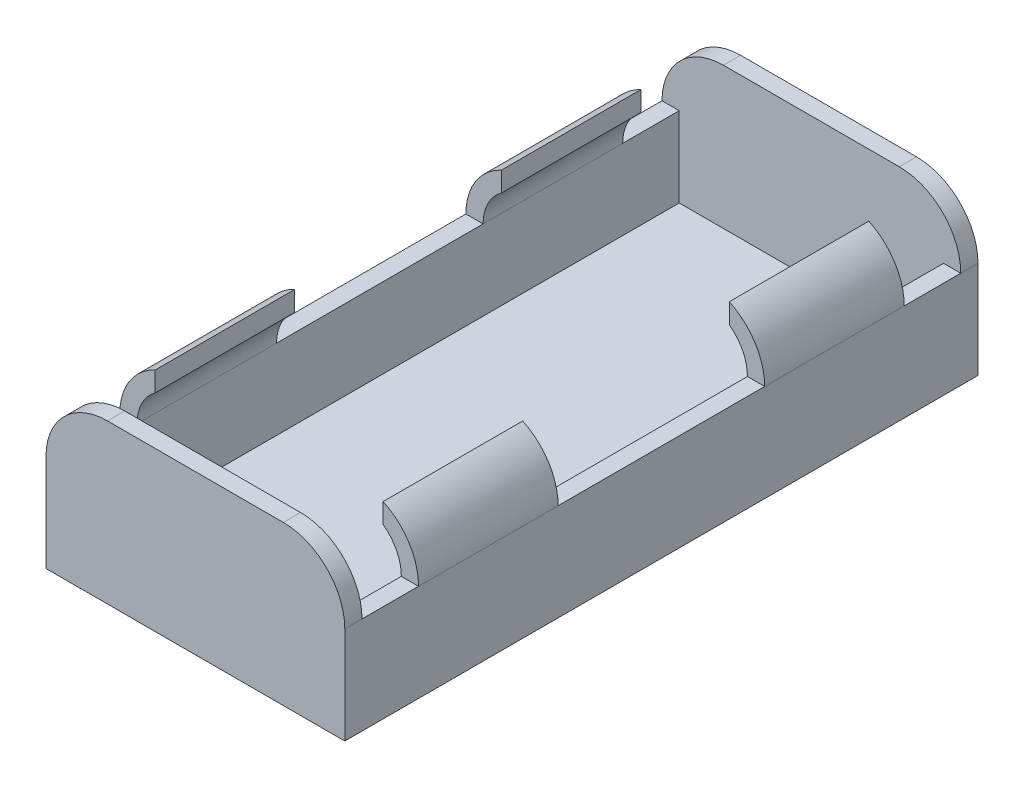
ISO-10303-21;
HEADER;
FILE_DESCRIPTION(('STEP AP214'),'2;1');
FILE_NAME('part.step','',(''),(''),'','','');
FILE_SCHEMA(('AUTOMOTIVE_DESIGN { 1 0 10303 214 1 1 1 1 }'));
ENDSEC;
DATA;
#1=APPLICATION_CONTEXT('core data for automotive mechanical design processes');
#2=APPLICATION_PROTOCOL_DEFINITION('international standard','automotive_design',2000,#1);
#3=PRODUCT_CONTEXT('',#1,'mechanical');
#4=PRODUCT('Part','Part','',(#3));
#5=PRODUCT_RELATED_PRODUCT_CATEGORY('part','',(#4));
#6=PRODUCT_DEFINITION_FORMATION('','',#4);
#7=PRODUCT_DEFINITION_CONTEXT('part definition',#1,'design');
#8=PRODUCT_DEFINITION('design','',#6,#7);
#9=PRODUCT_DEFINITION_SHAPE('','',#8);
#10=(LENGTH_UNIT() NAMED_UNIT(*) SI_UNIT(.MILLI.,.METRE.));
#11=(NAMED_UNIT(*) PLANE_ANGLE_UNIT() SI_UNIT($,.RADIAN.));
#12=(NAMED_UNIT(*) SI_UNIT($,.STERADIAN.) SOLID_ANGLE_UNIT());
#13=UNCERTAINTY_MEASURE_WITH_UNIT(LENGTH_MEASURE(1.E-05),#10,'distance_accuracy_value','');
#14=(GEOMETRIC_REPRESENTATION_CONTEXT(3) GLOBAL_UNCERTAINTY_ASSIGNED_CONTEXT((#13)) GLOBAL_UNIT_ASSIGNED_CONTEXT((#10,
#11,#12)) REPRESENTATION_CONTEXT('',''));
#15=CARTESIAN_POINT('',(0.,0.,0.));
#16=DIRECTION('',(0.,0.,1.));
#17=DIRECTION('',(1.,0.,0.));
#18=AXIS2_PLACEMENT_3D('',#15,#16,#17);
#19=CARTESIAN_POINT('',(-7.15,1.45,51.5));
#20=DIRECTION('',(0.,0.,-1.));
#21=DIRECTION('',(-1.,0.,0.));
#22=AXIS2_PLACEMENT_3D('',#19,#20,#21);
#23=CYLINDRICAL_SURFACE('',#22,5.);
#24=CARTESIAN_POINT('',(-7.15,1.45,34.15));
#25=DIRECTION('',(0.,0.,1.));
#26=DIRECTION('',(1.,0.,0.));
#27=AXIS2_PLACEMENT_3D('',#24,#25,#26);
#28=CIRCLE('',#27,5.);
#29=CARTESIAN_POINT('',(-12.15,1.45,34.15));
#30=VERTEX_POINT('',#29);
#31=CARTESIAN_POINT('',(-9.26964269805377,5.97847820272852,34.15));
#32=VERTEX_POINT('',#31);
#33=EDGE_CURVE('E434',#30,#32,#28,.F.);
#34=ORIENTED_EDGE('',*,*,#33,.F.);
#35=DIRECTION('',(0.,0.,-1.));
#36=VECTOR('',#35,1.);
#37=CARTESIAN_POINT('',(-12.15,1.45,51.5));
#38=LINE('',#37,#36);
#39=CARTESIAN_POINT('',(-12.15,1.45,45.5));
#40=VERTEX_POINT('',#39);
#41=EDGE_CURVE('E296',#40,#30,#38,.T.);
#42=ORIENTED_EDGE('',*,*,#41,.F.);
#43=CARTESIAN_POINT('',(-7.15,1.45,45.5));
#44=DIRECTION('',(0.,0.,-1.));
#45=DIRECTION('',(-1.,0.,0.));
#46=AXIS2_PLACEMENT_3D('',#43,#44,#45);
#47=CIRCLE('',#46,5.);
#48=CARTESIAN_POINT('',(-9.26964269805377,5.97847820272852,45.5));
#49=VERTEX_POINT('',#48);
#50=EDGE_CURVE('E406',#49,#40,#47,.F.);
#51=ORIENTED_EDGE('',*,*,#50,.F.);
#52=DIRECTION('',(0.,0.,-1.));
#53=VECTOR('',#52,1.);
#54=CARTESIAN_POINT('',(-9.26964269805377,5.97847820272852,51.5));
#55=LINE('',#54,#53);
#56=EDGE_CURVE('E360',#32,#49,#55,.F.);
#57=ORIENTED_EDGE('',*,*,#56,.F.);
#58=EDGE_LOOP('',(#34,#42,#51,#57));
#59=FACE_BOUND('',#58,.T.);
#60=ADVANCED_FACE('F32',(#59),#23,.T.);
#61=CARTESIAN_POINT('',(7.15000000000001,1.45,51.5));
#62=DIRECTION('',(0.,0.,-1.));
#63=DIRECTION('',(-1.,0.,0.));
#64=AXIS2_PLACEMENT_3D('',#61,#62,#63);
#65=CYLINDRICAL_SURFACE('',#64,5.);
#66=CARTESIAN_POINT('',(7.15000000000001,1.45,34.15));
#67=DIRECTION('',(0.,0.,1.));
#68=DIRECTION('',(1.,0.,0.));
#69=AXIS2_PLACEMENT_3D('',#66,#67,#68);
#70=CIRCLE('',#69,5.);
#71=CARTESIAN_POINT('',(9.26964269805377,5.97847820272852,34.15));
#72=VERTEX_POINT('',#71);
#73=CARTESIAN_POINT('',(12.15,1.45,34.15));
#74=VERTEX_POINT('',#73);
#75=EDGE_CURVE('E426',#72,#74,#70,.F.);
#76=ORIENTED_EDGE('',*,*,#75,.F.);
#77=DIRECTION('',(0.,0.,-1.));
#78=VECTOR('',#77,1.);
#79=CARTESIAN_POINT('',(9.26964269805377,5.97847820272852,51.5));
#80=LINE('',#79,#78);
#81=CARTESIAN_POINT('',(9.26964269805377,5.97847820272852,45.5));
#82=VERTEX_POINT('',#81);
#83=EDGE_CURVE('E361',#82,#72,#80,.T.);
#84=ORIENTED_EDGE('',*,*,#83,.F.);
#85=CARTESIAN_POINT('',(7.15000000000001,1.45,45.5));
#86=DIRECTION('',(0.,0.,-1.));
#87=DIRECTION('',(-1.,0.,0.));
#88=AXIS2_PLACEMENT_3D('',#85,#86,#87);
#89=CIRCLE('',#88,5.);
#90=CARTESIAN_POINT('',(12.15,1.45,45.5));
#91=VERTEX_POINT('',#90);
#92=EDGE_CURVE('E398',#91,#82,#89,.F.);
#93=ORIENTED_EDGE('',*,*,#92,.F.);
#94=DIRECTION('',(0.,0.,-1.));
#95=VECTOR('',#94,1.);
#96=CARTESIAN_POINT('',(12.15,1.45,51.5));
#97=LINE('',#96,#95);
#98=EDGE_CURVE('E263',#74,#91,#97,.F.);
#99=ORIENTED_EDGE('',*,*,#98,.F.);
#100=EDGE_LOOP('',(#76,#84,#93,#99));
#101=FACE_BOUND('',#100,.T.);
#102=ADVANCED_FACE('F588',(#101),#65,.T.);
#103=CARTESIAN_POINT('',(-7.15,1.45,51.5));
#104=DIRECTION('',(0.,0.,-1.));
#105=DIRECTION('',(-1.,0.,0.));
#106=AXIS2_PLACEMENT_3D('',#103,#104,#105);
#107=CYLINDRICAL_SURFACE('',#106,3.6);
#108=DIRECTION('',(0.,0.,1.));
#109=VECTOR('',#108,1.);
#110=CARTESIAN_POINT('',(-10.75,1.45,51.5));
#111=LINE('',#110,#109);
#112=CARTESIAN_POINT('',(-10.75,1.45,45.5));
#113=VERTEX_POINT('',#112);
#114=CARTESIAN_POINT('',(-10.75,1.45,34.15));
#115=VERTEX_POINT('',#114);
#116=EDGE_CURVE('E338',#113,#115,#111,.F.);
#117=ORIENTED_EDGE('',*,*,#116,.T.);
#118=CARTESIAN_POINT('',(-7.15,1.45,34.15));
#119=DIRECTION('',(0.,0.,1.));
#120=DIRECTION('',(1.,0.,0.));
#121=AXIS2_PLACEMENT_3D('',#118,#119,#120);
#122=CIRCLE('',#121,3.6);
#123=CARTESIAN_POINT('',(-9.26964269805377,4.35983072232515,34.15));
#124=VERTEX_POINT('',#123);
#125=EDGE_CURVE('E255',#115,#124,#122,.F.);
#126=ORIENTED_EDGE('',*,*,#125,.T.);
#127=DIRECTION('',(0.,0.,-1.));
#128=VECTOR('',#127,1.);
#129=CARTESIAN_POINT('',(-9.26964269805377,4.35983072232515,51.5));
#130=LINE('',#129,#128);
#131=CARTESIAN_POINT('',(-9.26964269805377,4.35983072232515,45.5));
#132=VERTEX_POINT('',#131);
#133=EDGE_CURVE('E517',#124,#132,#130,.F.);
#134=ORIENTED_EDGE('',*,*,#133,.T.);
#135=CARTESIAN_POINT('',(-7.15,1.45,45.5));
#136=DIRECTION('',(0.,0.,-1.));
#137=DIRECTION('',(-1.,0.,0.));
#138=AXIS2_PLACEMENT_3D('',#135,#136,#137);
#139=CIRCLE('',#138,3.6);
#140=EDGE_CURVE('E408',#132,#113,#139,.F.);
#141=ORIENTED_EDGE('',*,*,#140,.T.);
#142=EDGE_LOOP('',(#117,#126,#134,#141));
#143=FACE_BOUND('',#142,.T.);
#144=ADVANCED_FACE('F515',(#143),#107,.F.);
#145=CARTESIAN_POINT('',(7.15000000000001,1.45,51.5));
#146=DIRECTION('',(0.,0.,-1.));
#147=DIRECTION('',(-1.,0.,0.));
#148=AXIS2_PLACEMENT_3D('',#145,#146,#147);
#149=CYLINDRICAL_SURFACE('',#148,3.6);
#150=DIRECTION('',(0.,0.,-1.));
#151=VECTOR('',#150,1.);
#152=CARTESIAN_POINT('',(9.26964269805377,4.35983072232515,51.5));
#153=LINE('',#152,#151);
#154=CARTESIAN_POINT('',(9.26964269805377,4.35983072232515,45.5));
#155=VERTEX_POINT('',#154);
#156=CARTESIAN_POINT('',(9.26964269805377,4.35983072232515,34.15));
#157=VERTEX_POINT('',#156);
#158=EDGE_CURVE('E569',#155,#157,#153,.T.);
#159=ORIENTED_EDGE('',*,*,#158,.T.);
#160=CARTESIAN_POINT('',(7.15000000000001,1.45,34.15));
#161=DIRECTION('',(0.,0.,1.));
#162=DIRECTION('',(1.,0.,0.));
#163=AXIS2_PLACEMENT_3D('',#160,#161,#162);
#164=CIRCLE('',#163,3.6);
#165=CARTESIAN_POINT('',(10.75,1.45,34.15));
#166=VERTEX_POINT('',#165);
#167=EDGE_CURVE('E428',#157,#166,#164,.F.);
#168=ORIENTED_EDGE('',*,*,#167,.T.);
#169=DIRECTION('',(0.,0.,1.));
#170=VECTOR('',#169,1.);
#171=CARTESIAN_POINT('',(10.75,1.45,51.5));
#172=LINE('',#171,#170);
#173=CARTESIAN_POINT('',(10.75,1.45,45.5));
#174=VERTEX_POINT('',#173);
#175=EDGE_CURVE('E354',#166,#174,#172,.T.);
#176=ORIENTED_EDGE('',*,*,#175,.T.);
#177=CARTESIAN_POINT('',(7.15000000000001,1.45,45.5));
#178=DIRECTION('',(0.,0.,-1.));
#179=DIRECTION('',(-1.,0.,0.));
#180=AXIS2_PLACEMENT_3D('',#177,#178,#179);
#181=CIRCLE('',#180,3.6);
#182=EDGE_CURVE('E400',#174,#155,#181,.F.);
#183=ORIENTED_EDGE('',*,*,#182,.T.);
#184=EDGE_LOOP('',(#159,#168,#176,#183));
#185=FACE_BOUND('',#184,.T.);
#186=ADVANCED_FACE('F608',(#185),#149,.F.);
#187=CARTESIAN_POINT('',(9.26964269805377,1.45,1.4));
#188=DIRECTION('',(1.,0.,0.));
#189=DIRECTION('',(0.,0.,-1.));
#190=AXIS2_PLACEMENT_3D('',#187,#188,#189);
#191=PLANE('',#190);
#192=ORIENTED_EDGE('',*,*,#83,.T.);
#193=DIRECTION('',(0.,-1.,0.));
#194=VECTOR('',#193,1.);
#195=CARTESIAN_POINT('',(9.26964269805377,1.45,34.15));
#196=LINE('',#195,#194);
#197=EDGE_CURVE('E431',#72,#157,#196,.T.);
#198=ORIENTED_EDGE('',*,*,#197,.T.);
#199=ORIENTED_EDGE('',*,*,#158,.F.);
#200=DIRECTION('',(0.,1.,0.));
#201=VECTOR('',#200,1.);
#202=CARTESIAN_POINT('',(9.26964269805377,1.45,45.5));
#203=LINE('',#202,#201);
#204=EDGE_CURVE('E403',#155,#82,#203,.T.);
#205=ORIENTED_EDGE('',*,*,#204,.T.);
#206=EDGE_LOOP('',(#192,#198,#199,#205));
#207=FACE_BOUND('',#206,.T.);
#208=ADVANCED_FACE('F602',(#207),#191,.F.);
#209=CARTESIAN_POINT('',(-9.26964269805377,1.45,1.4));
#210=DIRECTION('',(-1.,0.,0.));
#211=DIRECTION('',(0.,0.,1.));
#212=AXIS2_PLACEMENT_3D('',#209,#210,#211);
#213=PLANE('',#212);
#214=ORIENTED_EDGE('',*,*,#133,.F.);
#215=DIRECTION('',(0.,1.,0.));
#216=VECTOR('',#215,1.);
#217=CARTESIAN_POINT('',(-9.26964269805377,1.45,34.15));
#218=LINE('',#217,#216);
#219=EDGE_CURVE('E11',#124,#32,#218,.T.);
#220=ORIENTED_EDGE('',*,*,#219,.T.);
#221=ORIENTED_EDGE('',*,*,#56,.T.);
#222=DIRECTION('',(0.,-1.,0.));
#223=VECTOR('',#222,1.);
#224=CARTESIAN_POINT('',(-9.26964269805377,1.45,45.5));
#225=LINE('',#224,#223);
#226=EDGE_CURVE('E575',#49,#132,#225,.T.);
#227=ORIENTED_EDGE('',*,*,#226,.T.);
#228=EDGE_LOOP('',(#214,#220,#221,#227));
#229=FACE_BOUND('',#228,.T.);
#230=ADVANCED_FACE('F598',(#229),#213,.F.);
#231=CARTESIAN_POINT('',(-7.15,1.45,50.1));
#232=DIRECTION('',(0.,0.,1.));
#233=DIRECTION('',(1.,0.,0.));
#234=AXIS2_PLACEMENT_3D('',#231,#232,#233);
#235=CIRCLE('',#234,5.);
#236=CARTESIAN_POINT('',(-12.15,1.45,50.1));
#237=VERTEX_POINT('',#236);
#238=CARTESIAN_POINT('',(-7.15,6.45,50.1));
#239=VERTEX_POINT('',#238);
#240=EDGE_CURVE('E364',#237,#239,#235,.F.);
#241=ORIENTED_EDGE('',*,*,#240,.F.);
#242=CARTESIAN_POINT('',(-12.15,1.45,51.5));
#243=VERTEX_POINT('',#242);
#244=EDGE_CURVE('E293',#243,#237,#38,.T.);
#245=ORIENTED_EDGE('',*,*,#244,.F.);
#246=CARTESIAN_POINT('',(-7.15,1.45,51.5));
#247=DIRECTION('',(0.,0.,1.));
#248=DIRECTION('',(1.,0.,0.));
#249=AXIS2_PLACEMENT_3D('',#246,#247,#248);
#250=CIRCLE('',#249,5.);
#251=CARTESIAN_POINT('',(-7.15,6.45,51.5));
#252=VERTEX_POINT('',#251);
#253=EDGE_CURVE('E269',#252,#243,#250,.T.);
#254=ORIENTED_EDGE('',*,*,#253,.F.);
#255=DIRECTION('',(0.,0.,-1.));
#256=VECTOR('',#255,1.);
#257=CARTESIAN_POINT('',(-7.15,6.45,51.5));
#258=LINE('',#257,#256);
#259=EDGE_CURVE('E284',#239,#252,#258,.F.);
#260=ORIENTED_EDGE('',*,*,#259,.F.);
#261=EDGE_LOOP('',(#241,#245,#254,#260));
#262=FACE_BOUND('',#261,.T.);
#263=ADVANCED_FACE('F495',(#262),#23,.T.);
#264=CARTESIAN_POINT('',(12.15,1.45,50.1));
#265=VERTEX_POINT('',#264);
#266=CARTESIAN_POINT('',(12.15,1.45,51.5));
#267=VERTEX_POINT('',#266);
#268=EDGE_CURVE('E265',#265,#267,#97,.F.);
#269=ORIENTED_EDGE('',*,*,#268,.F.);
#270=CARTESIAN_POINT('',(7.15000000000001,1.45,50.1));
#271=DIRECTION('',(0.,0.,1.));
#272=DIRECTION('',(1.,0.,0.));
#273=AXIS2_PLACEMENT_3D('',#270,#271,#272);
#274=CIRCLE('',#273,5.);
#275=CARTESIAN_POINT('',(7.15000000000001,6.45,50.1));
#276=VERTEX_POINT('',#275);
#277=EDGE_CURVE('E366',#276,#265,#274,.F.);
#278=ORIENTED_EDGE('',*,*,#277,.F.);
#279=DIRECTION('',(0.,0.,-1.));
#280=VECTOR('',#279,1.);
#281=CARTESIAN_POINT('',(7.15000000000001,6.45,51.5));
#282=LINE('',#281,#280);
#283=CARTESIAN_POINT('',(7.15000000000001,6.45,51.5));
#284=VERTEX_POINT('',#283);
#285=EDGE_CURVE('E285',#284,#276,#282,.T.);
#286=ORIENTED_EDGE('',*,*,#285,.F.);
#287=CARTESIAN_POINT('',(7.15000000000001,1.45,51.5));
#288=DIRECTION('',(0.,0.,1.));
#289=DIRECTION('',(1.,0.,0.));
#290=AXIS2_PLACEMENT_3D('',#287,#288,#289);
#291=CIRCLE('',#290,5.);
#292=EDGE_CURVE('E274',#267,#284,#291,.T.);
#293=ORIENTED_EDGE('',*,*,#292,.F.);
#294=EDGE_LOOP('',(#269,#278,#286,#293));
#295=FACE_BOUND('',#294,.T.);
#296=ADVANCED_FACE('F488',(#295),#65,.T.);
#297=CARTESIAN_POINT('',(-12.15,1.45,1.4));
#298=VERTEX_POINT('',#297);
#299=CARTESIAN_POINT('',(-12.15,1.45,0.));
#300=VERTEX_POINT('',#299);
#301=EDGE_CURVE('E298',#298,#300,#38,.T.);
#302=ORIENTED_EDGE('',*,*,#301,.F.);
#303=CARTESIAN_POINT('',(-7.15,1.45,1.4));
#304=DIRECTION('',(0.,0.,-1.));
#305=DIRECTION('',(-1.,0.,0.));
#306=AXIS2_PLACEMENT_3D('',#303,#304,#305);
#307=CIRCLE('',#306,5.);
#308=CARTESIAN_POINT('',(-7.15,6.45,1.4));
#309=VERTEX_POINT('',#308);
#310=EDGE_CURVE('E368',#309,#298,#307,.F.);
#311=ORIENTED_EDGE('',*,*,#310,.F.);
#312=CARTESIAN_POINT('',(-7.15,6.45,0.));
#313=VERTEX_POINT('',#312);
#314=EDGE_CURVE('E279',#313,#309,#258,.F.);
#315=ORIENTED_EDGE('',*,*,#314,.F.);
#316=CARTESIAN_POINT('',(-7.15,1.45,0.));
#317=DIRECTION('',(0.,0.,1.));
#318=DIRECTION('',(1.,0.,0.));
#319=AXIS2_PLACEMENT_3D('',#316,#317,#318);
#320=CIRCLE('',#319,5.);
#321=EDGE_CURVE('E289',#300,#313,#320,.F.);
#322=ORIENTED_EDGE('',*,*,#321,.F.);
#323=EDGE_LOOP('',(#302,#311,#315,#322));
#324=FACE_BOUND('',#323,.T.);
#325=ADVANCED_FACE('F472',(#324),#23,.T.);
#326=CARTESIAN_POINT('',(7.15000000000001,1.45,1.4));
#327=DIRECTION('',(0.,0.,-1.));
#328=DIRECTION('',(-1.,0.,0.));
#329=AXIS2_PLACEMENT_3D('',#326,#327,#328);
#330=CIRCLE('',#329,5.);
#331=CARTESIAN_POINT('',(12.15,1.45,1.4));
#332=VERTEX_POINT('',#331);
#333=CARTESIAN_POINT('',(7.15000000000001,6.45,1.4));
#334=VERTEX_POINT('',#333);
#335=EDGE_CURVE('E370',#332,#334,#330,.F.);
#336=ORIENTED_EDGE('',*,*,#335,.F.);
#337=CARTESIAN_POINT('',(12.15,1.45,0.));
#338=VERTEX_POINT('',#337);
#339=EDGE_CURVE('E262',#338,#332,#97,.F.);
#340=ORIENTED_EDGE('',*,*,#339,.F.);
#341=CARTESIAN_POINT('',(7.15000000000001,1.45,0.));
#342=DIRECTION('',(0.,0.,1.));
#343=DIRECTION('',(1.,0.,0.));
#344=AXIS2_PLACEMENT_3D('',#341,#342,#343);
#345=CIRCLE('',#344,5.);
#346=CARTESIAN_POINT('',(7.15000000000001,6.45,0.));
#347=VERTEX_POINT('',#346);
#348=EDGE_CURVE('E291',#347,#338,#345,.F.);
#349=ORIENTED_EDGE('',*,*,#348,.F.);
#350=EDGE_CURVE('E288',#334,#347,#282,.T.);
#351=ORIENTED_EDGE('',*,*,#350,.F.);
#352=EDGE_LOOP('',(#336,#340,#349,#351));
#353=FACE_BOUND('',#352,.T.);
#354=ADVANCED_FACE('F549',(#353),#65,.T.);
#355=CARTESIAN_POINT('',(-12.15,6.45,51.5));
#356=DIRECTION('',(0.,-1.,0.));
#357=DIRECTION('',(0.,0.,-1.));
#358=AXIS2_PLACEMENT_3D('',#355,#356,#357);
#359=PLANE('',#358);
#360=DIRECTION('',(-1.,0.,0.));
#361=VECTOR('',#360,1.);
#362=CARTESIAN_POINT('',(-12.15,6.45,1.4));
#363=LINE('',#362,#361);
#364=EDGE_CURVE('E323',#334,#309,#363,.T.);
#365=ORIENTED_EDGE('',*,*,#364,.F.);
#366=ORIENTED_EDGE('',*,*,#350,.T.);
#367=DIRECTION('',(-1.,0.,0.));
#368=VECTOR('',#367,1.);
#369=CARTESIAN_POINT('',(-12.15,6.45,0.));
#370=LINE('',#369,#368);
#371=EDGE_CURVE('E311',#347,#313,#370,.T.);
#372=ORIENTED_EDGE('',*,*,#371,.T.);
#373=ORIENTED_EDGE('',*,*,#314,.T.);
#374=EDGE_LOOP('',(#365,#366,#372,#373));
#375=FACE_BOUND('',#374,.T.);
#376=ADVANCED_FACE('F546',(#375),#359,.F.);
#377=CARTESIAN_POINT('',(12.15,6.45,51.5));
#378=DIRECTION('',(-1.,0.,0.));
#379=DIRECTION('',(0.,-1.,0.));
#380=AXIS2_PLACEMENT_3D('',#377,#378,#379);
#381=PLANE('',#380);
#382=DIRECTION('',(0.,1.,0.));
#383=VECTOR('',#382,1.);
#384=CARTESIAN_POINT('',(12.15,6.45,0.));
#385=LINE('',#384,#383);
#386=CARTESIAN_POINT('',(12.15,-6.45,0.));
#387=VERTEX_POINT('',#386);
#388=EDGE_CURVE('E314',#387,#338,#385,.T.);
#389=ORIENTED_EDGE('',*,*,#388,.T.);
#390=ORIENTED_EDGE('',*,*,#339,.T.);
#391=DIRECTION('',(0.,0.,-1.));
#392=VECTOR('',#391,1.);
#393=CARTESIAN_POINT('',(12.15,1.45,1.4));
#394=LINE('',#393,#392);
#395=CARTESIAN_POINT('',(12.15,1.45,6.));
#396=VERTEX_POINT('',#395);
#397=EDGE_CURVE('E261',#396,#332,#394,.T.);
#398=ORIENTED_EDGE('',*,*,#397,.F.);
#399=CARTESIAN_POINT('',(12.15,1.45,17.35));
#400=VERTEX_POINT('',#399);
#401=EDGE_CURVE('E252',#396,#400,#97,.F.);
#402=ORIENTED_EDGE('',*,*,#401,.T.);
#403=DIRECTION('',(0.,0.,-1.));
#404=VECTOR('',#403,1.);
#405=CARTESIAN_POINT('',(12.15,1.45,17.35));
#406=LINE('',#405,#404);
#407=EDGE_CURVE('E240',#74,#400,#406,.T.);
#408=ORIENTED_EDGE('',*,*,#407,.F.);
#409=ORIENTED_EDGE('',*,*,#98,.T.);
#410=DIRECTION('',(0.,0.,-1.));
#411=VECTOR('',#410,1.);
#412=CARTESIAN_POINT('',(12.15,1.45,50.1));
#413=LINE('',#412,#411);
#414=EDGE_CURVE('E418',#265,#91,#413,.T.);
#415=ORIENTED_EDGE('',*,*,#414,.F.);
#416=ORIENTED_EDGE('',*,*,#268,.T.);
#417=DIRECTION('',(0.,1.,0.));
#418=VECTOR('',#417,1.);
#419=CARTESIAN_POINT('',(12.15,6.45,51.5));
#420=LINE('',#419,#418);
#421=CARTESIAN_POINT('',(12.15,-6.45,51.5));
#422=VERTEX_POINT('',#421);
#423=EDGE_CURVE('E308',#422,#267,#420,.T.);
#424=ORIENTED_EDGE('',*,*,#423,.F.);
#425=DIRECTION('',(0.,0.,-1.));
#426=VECTOR('',#425,1.);
#427=CARTESIAN_POINT('',(12.15,-6.45,51.5));
#428=LINE('',#427,#426);
#429=EDGE_CURVE('E302',#422,#387,#428,.T.);
#430=ORIENTED_EDGE('',*,*,#429,.T.);
#431=EDGE_LOOP('',(#389,#390,#398,#402,#408,#409,#415,#416,#424,#430));
#432=FACE_BOUND('',#431,.T.);
#433=ADVANCED_FACE('F258',(#432),#381,.F.);
#434=ORIENTED_EDGE('',*,*,#285,.T.);
#435=DIRECTION('',(-1.,0.,0.));
#436=VECTOR('',#435,1.);
#437=CARTESIAN_POINT('',(-12.15,6.45,50.1));
#438=LINE('',#437,#436);
#439=EDGE_CURVE('E328',#276,#239,#438,.T.);
#440=ORIENTED_EDGE('',*,*,#439,.T.);
#441=ORIENTED_EDGE('',*,*,#259,.T.);
#442=DIRECTION('',(-1.,0.,0.));
#443=VECTOR('',#442,1.);
#444=CARTESIAN_POINT('',(-12.15,6.45,51.5));
#445=LINE('',#444,#443);
#446=EDGE_CURVE('E320',#284,#252,#445,.T.);
#447=ORIENTED_EDGE('',*,*,#446,.F.);
#448=EDGE_LOOP('',(#434,#440,#441,#447));
#449=FACE_BOUND('',#448,.T.);
#450=ADVANCED_FACE('F491',(#449),#359,.F.);
#451=CARTESIAN_POINT('',(-12.15,6.45,51.5));
#452=DIRECTION('',(1.,0.,0.));
#453=DIRECTION('',(0.,1.,0.));
#454=AXIS2_PLACEMENT_3D('',#451,#452,#453);
#455=PLANE('',#454);
#456=DIRECTION('',(0.,-1.,0.));
#457=VECTOR('',#456,1.);
#458=CARTESIAN_POINT('',(-12.15,6.45,51.5));
#459=LINE('',#458,#457);
#460=CARTESIAN_POINT('',(-12.15,-6.45,51.5));
#461=VERTEX_POINT('',#460);
#462=EDGE_CURVE('E318',#243,#461,#459,.T.);
#463=ORIENTED_EDGE('',*,*,#462,.F.);
#464=ORIENTED_EDGE('',*,*,#244,.T.);
#465=DIRECTION('',(0.,0.,1.));
#466=VECTOR('',#465,1.);
#467=CARTESIAN_POINT('',(-12.15,1.45,50.1));
#468=LINE('',#467,#466);
#469=EDGE_CURVE('E411',#40,#237,#468,.T.);
#470=ORIENTED_EDGE('',*,*,#469,.F.);
#471=ORIENTED_EDGE('',*,*,#41,.T.);
#472=DIRECTION('',(0.,0.,1.));
#473=VECTOR('',#472,1.);
#474=CARTESIAN_POINT('',(-12.15,1.45,17.35));
#475=LINE('',#474,#473);
#476=CARTESIAN_POINT('',(-12.15,1.45,17.35));
#477=VERTEX_POINT('',#476);
#478=EDGE_CURVE('E235',#477,#30,#475,.T.);
#479=ORIENTED_EDGE('',*,*,#478,.F.);
#480=CARTESIAN_POINT('',(-12.15,1.45,6.));
#481=VERTEX_POINT('',#480);
#482=EDGE_CURVE('E297',#477,#481,#38,.T.);
#483=ORIENTED_EDGE('',*,*,#482,.T.);
#484=DIRECTION('',(0.,0.,1.));
#485=VECTOR('',#484,1.);
#486=CARTESIAN_POINT('',(-12.15,1.45,1.4));
#487=LINE('',#486,#485);
#488=EDGE_CURVE('E395',#298,#481,#487,.T.);
#489=ORIENTED_EDGE('',*,*,#488,.F.);
#490=ORIENTED_EDGE('',*,*,#301,.T.);
#491=DIRECTION('',(0.,-1.,0.));
#492=VECTOR('',#491,1.);
#493=CARTESIAN_POINT('',(-12.15,6.45,0.));
#494=LINE('',#493,#492);
#495=CARTESIAN_POINT('',(-12.15,-6.45,0.));
#496=VERTEX_POINT('',#495);
#497=EDGE_CURVE('E309',#300,#496,#494,.T.);
#498=ORIENTED_EDGE('',*,*,#497,.T.);
#499=DIRECTION('',(0.,0.,-1.));
#500=VECTOR('',#499,1.);
#501=CARTESIAN_POINT('',(-12.15,-6.45,51.5));
#502=LINE('',#501,#500);
#503=EDGE_CURVE('E299',#461,#496,#502,.T.);
#504=ORIENTED_EDGE('',*,*,#503,.F.);
#505=EDGE_LOOP('',(#463,#464,#470,#471,#479,#483,#489,#490,#498,#504));
#506=FACE_BOUND('',#505,.T.);
#507=ADVANCED_FACE('F464',(#506),#455,.F.);
#508=CARTESIAN_POINT('',(-12.15,-6.45,51.5));
#509=DIRECTION('',(0.,1.,0.));
#510=DIRECTION('',(0.,0.,1.));
#511=AXIS2_PLACEMENT_3D('',#508,#509,#510);
#512=PLANE('',#511);
#513=DIRECTION('',(1.,0.,0.));
#514=VECTOR('',#513,1.);
#515=CARTESIAN_POINT('',(-12.15,-6.45,0.));
#516=LINE('',#515,#514);
#517=EDGE_CURVE('E306',#496,#387,#516,.T.);
#518=ORIENTED_EDGE('',*,*,#517,.T.);
#519=ORIENTED_EDGE('',*,*,#429,.F.);
#520=DIRECTION('',(1.,0.,0.));
#521=VECTOR('',#520,1.);
#522=CARTESIAN_POINT('',(-12.15,-6.45,51.5));
#523=LINE('',#522,#521);
#524=EDGE_CURVE('E305',#461,#422,#523,.T.);
#525=ORIENTED_EDGE('',*,*,#524,.F.);
#526=ORIENTED_EDGE('',*,*,#503,.T.);
#527=EDGE_LOOP('',(#518,#519,#525,#526));
#528=FACE_BOUND('',#527,.T.);
#529=ADVANCED_FACE('F480',(#528),#512,.F.);
#530=CARTESIAN_POINT('',(0.,0.,51.5));
#531=DIRECTION('',(0.,0.,1.));
#532=DIRECTION('',(1.,0.,0.));
#533=AXIS2_PLACEMENT_3D('',#530,#531,#532);
#534=PLANE('',#533);
#535=ORIENTED_EDGE('',*,*,#446,.T.);
#536=ORIENTED_EDGE('',*,*,#253,.T.);
#537=ORIENTED_EDGE('',*,*,#462,.T.);
#538=ORIENTED_EDGE('',*,*,#524,.T.);
#539=ORIENTED_EDGE('',*,*,#423,.T.);
#540=ORIENTED_EDGE('',*,*,#292,.T.);
#541=EDGE_LOOP('',(#535,#536,#537,#538,#539,#540));
#542=FACE_BOUND('',#541,.T.);
#543=ADVANCED_FACE('F484',(#542),#534,.T.);
#544=CARTESIAN_POINT('',(0.,0.,0.));
#545=DIRECTION('',(0.,0.,1.));
#546=DIRECTION('',(1.,0.,0.));
#547=AXIS2_PLACEMENT_3D('',#544,#545,#546);
#548=PLANE('',#547);
#549=ORIENTED_EDGE('',*,*,#497,.F.);
#550=ORIENTED_EDGE('',*,*,#321,.T.);
#551=ORIENTED_EDGE('',*,*,#371,.F.);
#552=ORIENTED_EDGE('',*,*,#348,.T.);
#553=ORIENTED_EDGE('',*,*,#388,.F.);
#554=ORIENTED_EDGE('',*,*,#517,.F.);
#555=EDGE_LOOP('',(#549,#550,#551,#552,#553,#554));
#556=FACE_BOUND('',#555,.T.);
#557=ADVANCED_FACE('F476',(#556),#548,.F.);
#558=CARTESIAN_POINT('',(-7.15,1.45,17.35));
#559=DIRECTION('',(0.,0.,-1.));
#560=DIRECTION('',(-1.,0.,0.));
#561=AXIS2_PLACEMENT_3D('',#558,#559,#560);
#562=CIRCLE('',#561,5.);
#563=CARTESIAN_POINT('',(-9.26964269805377,5.97847820272852,17.35));
#564=VERTEX_POINT('',#563);
#565=EDGE_CURVE('E441',#564,#477,#562,.F.);
#566=ORIENTED_EDGE('',*,*,#565,.F.);
#567=CARTESIAN_POINT('',(-9.26964269805377,5.97847820272852,6.));
#568=VERTEX_POINT('',#567);
#569=EDGE_CURVE('E357',#568,#564,#55,.F.);
#570=ORIENTED_EDGE('',*,*,#569,.F.);
#571=CARTESIAN_POINT('',(-7.15,1.45,6.));
#572=DIRECTION('',(0.,0.,1.));
#573=DIRECTION('',(1.,0.,0.));
#574=AXIS2_PLACEMENT_3D('',#571,#572,#573);
#575=CIRCLE('',#574,5.);
#576=EDGE_CURVE('E382',#481,#568,#575,.F.);
#577=ORIENTED_EDGE('',*,*,#576,.F.);
#578=ORIENTED_EDGE('',*,*,#482,.F.);
#579=EDGE_LOOP('',(#566,#570,#577,#578));
#580=FACE_BOUND('',#579,.T.);
#581=ADVANCED_FACE('F582',(#580),#23,.T.);
#582=CARTESIAN_POINT('',(7.15000000000001,1.45,17.35));
#583=DIRECTION('',(0.,0.,-1.));
#584=DIRECTION('',(-1.,0.,0.));
#585=AXIS2_PLACEMENT_3D('',#582,#583,#584);
#586=CIRCLE('',#585,5.);
#587=CARTESIAN_POINT('',(9.26964269805377,5.97847820272852,17.35));
#588=VERTEX_POINT('',#587);
#589=EDGE_CURVE('E47',#400,#588,#586,.F.);
#590=ORIENTED_EDGE('',*,*,#589,.F.);
#591=ORIENTED_EDGE('',*,*,#401,.F.);
#592=CARTESIAN_POINT('',(7.15000000000001,1.45,6.));
#593=DIRECTION('',(0.,0.,1.));
#594=DIRECTION('',(1.,0.,0.));
#595=AXIS2_PLACEMENT_3D('',#592,#593,#594);
#596=CIRCLE('',#595,5.);
#597=CARTESIAN_POINT('',(9.26964269805377,5.97847820272852,6.));
#598=VERTEX_POINT('',#597);
#599=EDGE_CURVE('E374',#598,#396,#596,.F.);
#600=ORIENTED_EDGE('',*,*,#599,.F.);
#601=EDGE_CURVE('E254',#588,#598,#80,.T.);
#602=ORIENTED_EDGE('',*,*,#601,.F.);
#603=EDGE_LOOP('',(#590,#591,#600,#602));
#604=FACE_BOUND('',#603,.T.);
#605=ADVANCED_FACE('F34',(#604),#65,.T.);
#606=CARTESIAN_POINT('',(10.75,6.45,51.5));
#607=DIRECTION('',(-1.,0.,0.));
#608=DIRECTION('',(0.,-1.,0.));
#609=AXIS2_PLACEMENT_3D('',#606,#607,#608);
#610=PLANE('',#609);
#611=DIRECTION('',(0.,1.,0.));
#612=VECTOR('',#611,1.);
#613=CARTESIAN_POINT('',(10.75,6.45,1.4));
#614=LINE('',#613,#612);
#615=CARTESIAN_POINT('',(10.75,-5.05,1.4));
#616=VERTEX_POINT('',#615);
#617=CARTESIAN_POINT('',(10.75,1.45,1.4));
#618=VERTEX_POINT('',#617);
#619=EDGE_CURVE('E327',#616,#618,#614,.T.);
#620=ORIENTED_EDGE('',*,*,#619,.F.);
#621=DIRECTION('',(0.,0.,-1.));
#622=VECTOR('',#621,1.);
#623=CARTESIAN_POINT('',(10.75,-5.05,51.5));
#624=LINE('',#623,#622);
#625=CARTESIAN_POINT('',(10.75,-5.05,50.1));
#626=VERTEX_POINT('',#625);
#627=EDGE_CURVE('E345',#626,#616,#624,.T.);
#628=ORIENTED_EDGE('',*,*,#627,.F.);
#629=DIRECTION('',(0.,1.,0.));
#630=VECTOR('',#629,1.);
#631=CARTESIAN_POINT('',(10.75,6.45,50.1));
#632=LINE('',#631,#630);
#633=CARTESIAN_POINT('',(10.75,1.45,50.1));
#634=VERTEX_POINT('',#633);
#635=EDGE_CURVE('E332',#626,#634,#632,.T.);
#636=ORIENTED_EDGE('',*,*,#635,.T.);
#637=EDGE_CURVE('E337',#174,#634,#172,.T.);
#638=ORIENTED_EDGE('',*,*,#637,.F.);
#639=ORIENTED_EDGE('',*,*,#175,.F.);
#640=CARTESIAN_POINT('',(10.75,1.45,17.35));
#641=VERTEX_POINT('',#640);
#642=EDGE_CURVE('E854',#641,#166,#172,.T.);
#643=ORIENTED_EDGE('',*,*,#642,.F.);
#644=CARTESIAN_POINT('',(10.75,1.45,6.));
#645=VERTEX_POINT('',#644);
#646=EDGE_CURVE('E353',#645,#641,#172,.T.);
#647=ORIENTED_EDGE('',*,*,#646,.F.);
#648=EDGE_CURVE('E316',#618,#645,#172,.T.);
#649=ORIENTED_EDGE('',*,*,#648,.F.);
#650=EDGE_LOOP('',(#620,#628,#636,#638,#639,#643,#647,#649));
#651=FACE_BOUND('',#650,.T.);
#652=ADVANCED_FACE('F559',(#651),#610,.T.);
#653=CARTESIAN_POINT('',(-10.75,6.45,51.5));
#654=DIRECTION('',(1.,0.,0.));
#655=DIRECTION('',(0.,1.,0.));
#656=AXIS2_PLACEMENT_3D('',#653,#654,#655);
#657=PLANE('',#656);
#658=DIRECTION('',(0.,-1.,0.));
#659=VECTOR('',#658,1.);
#660=CARTESIAN_POINT('',(-10.75,6.45,50.1));
#661=LINE('',#660,#659);
#662=CARTESIAN_POINT('',(-10.75,1.45,50.1));
#663=VERTEX_POINT('',#662);
#664=CARTESIAN_POINT('',(-10.75,-5.05,50.1));
#665=VERTEX_POINT('',#664);
#666=EDGE_CURVE('E331',#663,#665,#661,.T.);
#667=ORIENTED_EDGE('',*,*,#666,.T.);
#668=DIRECTION('',(0.,0.,-1.));
#669=VECTOR('',#668,1.);
#670=CARTESIAN_POINT('',(-10.75,-5.05,51.5));
#671=LINE('',#670,#669);
#672=CARTESIAN_POINT('',(-10.75,-5.05,1.4));
#673=VERTEX_POINT('',#672);
#674=EDGE_CURVE('E342',#665,#673,#671,.T.);
#675=ORIENTED_EDGE('',*,*,#674,.T.);
#676=DIRECTION('',(0.,-1.,0.));
#677=VECTOR('',#676,1.);
#678=CARTESIAN_POINT('',(-10.75,6.45,1.4));
#679=LINE('',#678,#677);
#680=CARTESIAN_POINT('',(-10.75,1.45,1.4));
#681=VERTEX_POINT('',#680);
#682=EDGE_CURVE('E326',#681,#673,#679,.T.);
#683=ORIENTED_EDGE('',*,*,#682,.F.);
#684=DIRECTION('',(0.,0.,-1.));
#685=VECTOR('',#684,1.);
#686=CARTESIAN_POINT('',(-10.75,1.45,51.5));
#687=LINE('',#686,#685);
#688=CARTESIAN_POINT('',(-10.75,1.45,6.));
#689=VERTEX_POINT('',#688);
#690=EDGE_CURVE('E372',#689,#681,#687,.T.);
#691=ORIENTED_EDGE('',*,*,#690,.F.);
#692=CARTESIAN_POINT('',(-10.75,1.45,17.35));
#693=VERTEX_POINT('',#692);
#694=EDGE_CURVE('E339',#693,#689,#111,.F.);
#695=ORIENTED_EDGE('',*,*,#694,.F.);
#696=DIRECTION('',(0.,0.,-1.));
#697=VECTOR('',#696,1.);
#698=CARTESIAN_POINT('',(-10.75,1.45,51.5));
#699=LINE('',#698,#697);
#700=EDGE_CURVE('E424',#115,#693,#699,.T.);
#701=ORIENTED_EDGE('',*,*,#700,.F.);
#702=ORIENTED_EDGE('',*,*,#116,.F.);
#703=EDGE_CURVE('E335',#663,#113,#111,.F.);
#704=ORIENTED_EDGE('',*,*,#703,.F.);
#705=EDGE_LOOP('',(#667,#675,#683,#691,#695,#701,#702,#704));
#706=FACE_BOUND('',#705,.T.);
#707=ADVANCED_FACE('F519',(#706),#657,.T.);
#708=CARTESIAN_POINT('',(-12.15,-5.05,51.5));
#709=DIRECTION('',(0.,1.,0.));
#710=DIRECTION('',(0.,0.,1.));
#711=AXIS2_PLACEMENT_3D('',#708,#709,#710);
#712=PLANE('',#711);
#713=DIRECTION('',(1.,0.,0.));
#714=VECTOR('',#713,1.);
#715=CARTESIAN_POINT('',(-12.15,-5.05,1.4));
#716=LINE('',#715,#714);
#717=EDGE_CURVE('E334',#673,#616,#716,.T.);
#718=ORIENTED_EDGE('',*,*,#717,.F.);
#719=ORIENTED_EDGE('',*,*,#674,.F.);
#720=DIRECTION('',(1.,0.,0.));
#721=VECTOR('',#720,1.);
#722=CARTESIAN_POINT('',(-12.15,-5.05,50.1));
#723=LINE('',#722,#721);
#724=EDGE_CURVE('E341',#665,#626,#723,.T.);
#725=ORIENTED_EDGE('',*,*,#724,.T.);
#726=ORIENTED_EDGE('',*,*,#627,.T.);
#727=EDGE_LOOP('',(#718,#719,#725,#726));
#728=FACE_BOUND('',#727,.T.);
#729=ADVANCED_FACE('F627',(#728),#712,.T.);
#730=CARTESIAN_POINT('',(0.,0.,50.1));
#731=DIRECTION('',(0.,0.,1.));
#732=DIRECTION('',(1.,0.,0.));
#733=AXIS2_PLACEMENT_3D('',#730,#731,#732);
#734=PLANE('',#733);
#735=DIRECTION('',(1.,0.,0.));
#736=VECTOR('',#735,1.);
#737=CARTESIAN_POINT('',(-12.15,1.45,50.1));
#738=LINE('',#737,#736);
#739=EDGE_CURVE('E423',#634,#265,#738,.T.);
#740=ORIENTED_EDGE('',*,*,#739,.F.);
#741=ORIENTED_EDGE('',*,*,#635,.F.);
#742=ORIENTED_EDGE('',*,*,#724,.F.);
#743=ORIENTED_EDGE('',*,*,#666,.F.);
#744=EDGE_CURVE('E421',#237,#663,#738,.T.);
#745=ORIENTED_EDGE('',*,*,#744,.F.);
#746=ORIENTED_EDGE('',*,*,#240,.T.);
#747=ORIENTED_EDGE('',*,*,#439,.F.);
#748=ORIENTED_EDGE('',*,*,#277,.T.);
#749=EDGE_LOOP('',(#740,#741,#742,#743,#745,#746,#747,#748));
#750=FACE_BOUND('',#749,.T.);
#751=ADVANCED_FACE('F500',(#750),#734,.F.);
#752=CARTESIAN_POINT('',(0.,0.,1.4));
#753=DIRECTION('',(0.,0.,1.));
#754=DIRECTION('',(1.,0.,0.));
#755=AXIS2_PLACEMENT_3D('',#752,#753,#754);
#756=PLANE('',#755);
#757=DIRECTION('',(-1.,0.,0.));
#758=VECTOR('',#757,1.);
#759=CARTESIAN_POINT('',(-12.15,1.45,1.4));
#760=LINE('',#759,#758);
#761=EDGE_CURVE('E389',#681,#298,#760,.T.);
#762=ORIENTED_EDGE('',*,*,#761,.F.);
#763=ORIENTED_EDGE('',*,*,#682,.T.);
#764=ORIENTED_EDGE('',*,*,#717,.T.);
#765=ORIENTED_EDGE('',*,*,#619,.T.);
#766=EDGE_CURVE('E387',#332,#618,#760,.T.);
#767=ORIENTED_EDGE('',*,*,#766,.F.);
#768=ORIENTED_EDGE('',*,*,#335,.T.);
#769=ORIENTED_EDGE('',*,*,#364,.T.);
#770=ORIENTED_EDGE('',*,*,#310,.T.);
#771=EDGE_LOOP('',(#762,#763,#764,#765,#767,#768,#769,#770));
#772=FACE_BOUND('',#771,.T.);
#773=ADVANCED_FACE('F541',(#772),#756,.T.);
#774=CARTESIAN_POINT('',(-9.26964269805377,4.35983072232515,6.));
#775=VERTEX_POINT('',#774);
#776=CARTESIAN_POINT('',(-9.26964269805377,4.35983072232515,17.35));
#777=VERTEX_POINT('',#776);
#778=EDGE_CURVE('E572',#775,#777,#130,.F.);
#779=ORIENTED_EDGE('',*,*,#778,.T.);
#780=CARTESIAN_POINT('',(-7.15,1.45,17.35));
#781=DIRECTION('',(0.,0.,-1.));
#782=DIRECTION('',(-1.,0.,0.));
#783=AXIS2_PLACEMENT_3D('',#780,#781,#782);
#784=CIRCLE('',#783,3.6);
#785=EDGE_CURVE('E55',#777,#693,#784,.F.);
#786=ORIENTED_EDGE('',*,*,#785,.T.);
#787=ORIENTED_EDGE('',*,*,#694,.T.);
#788=CARTESIAN_POINT('',(-7.15,1.45,6.));
#789=DIRECTION('',(0.,0.,1.));
#790=DIRECTION('',(1.,0.,0.));
#791=AXIS2_PLACEMENT_3D('',#788,#789,#790);
#792=CIRCLE('',#791,3.6);
#793=EDGE_CURVE('E384',#689,#775,#792,.F.);
#794=ORIENTED_EDGE('',*,*,#793,.T.);
#795=EDGE_LOOP('',(#779,#786,#787,#794));
#796=FACE_BOUND('',#795,.T.);
#797=ADVANCED_FACE('F524',(#796),#107,.F.);
#798=ORIENTED_EDGE('',*,*,#646,.T.);
#799=CARTESIAN_POINT('',(7.15000000000001,1.45,17.35));
#800=DIRECTION('',(0.,0.,-1.));
#801=DIRECTION('',(-1.,0.,0.));
#802=AXIS2_PLACEMENT_3D('',#799,#800,#801);
#803=CIRCLE('',#802,3.6);
#804=CARTESIAN_POINT('',(9.26964269805377,4.35983072232515,17.35));
#805=VERTEX_POINT('',#804);
#806=EDGE_CURVE('E232',#641,#805,#803,.F.);
#807=ORIENTED_EDGE('',*,*,#806,.T.);
#808=CARTESIAN_POINT('',(9.26964269805377,4.35983072232515,6.));
#809=VERTEX_POINT('',#808);
#810=EDGE_CURVE('E266',#805,#809,#153,.T.);
#811=ORIENTED_EDGE('',*,*,#810,.T.);
#812=CARTESIAN_POINT('',(7.15000000000001,1.45,6.));
#813=DIRECTION('',(0.,0.,1.));
#814=DIRECTION('',(1.,0.,0.));
#815=AXIS2_PLACEMENT_3D('',#812,#813,#814);
#816=CIRCLE('',#815,3.6);
#817=EDGE_CURVE('E376',#809,#645,#816,.F.);
#818=ORIENTED_EDGE('',*,*,#817,.T.);
#819=EDGE_LOOP('',(#798,#807,#811,#818));
#820=FACE_BOUND('',#819,.T.);
#821=ADVANCED_FACE('F566',(#820),#149,.F.);
#822=ORIENTED_EDGE('',*,*,#810,.F.);
#823=DIRECTION('',(0.,1.,0.));
#824=VECTOR('',#823,1.);
#825=CARTESIAN_POINT('',(9.26964269805377,1.45,17.35));
#826=LINE('',#825,#824);
#827=EDGE_CURVE('E439',#805,#588,#826,.T.);
#828=ORIENTED_EDGE('',*,*,#827,.T.);
#829=ORIENTED_EDGE('',*,*,#601,.T.);
#830=DIRECTION('',(0.,-1.,0.));
#831=VECTOR('',#830,1.);
#832=CARTESIAN_POINT('',(9.26964269805377,1.45,6.));
#833=LINE('',#832,#831);
#834=EDGE_CURVE('E379',#598,#809,#833,.T.);
#835=ORIENTED_EDGE('',*,*,#834,.T.);
#836=EDGE_LOOP('',(#822,#828,#829,#835));
#837=FACE_BOUND('',#836,.T.);
#838=ADVANCED_FACE('F611',(#837),#191,.F.);
#839=ORIENTED_EDGE('',*,*,#569,.T.);
#840=DIRECTION('',(0.,-1.,0.));
#841=VECTOR('',#840,1.);
#842=CARTESIAN_POINT('',(-9.26964269805377,1.45,17.35));
#843=LINE('',#842,#841);
#844=EDGE_CURVE('E40',#564,#777,#843,.T.);
#845=ORIENTED_EDGE('',*,*,#844,.T.);
#846=ORIENTED_EDGE('',*,*,#778,.F.);
#847=DIRECTION('',(0.,1.,0.));
#848=VECTOR('',#847,1.);
#849=CARTESIAN_POINT('',(-9.26964269805377,1.45,6.));
#850=LINE('',#849,#848);
#851=EDGE_CURVE('E531',#775,#568,#850,.T.);
#852=ORIENTED_EDGE('',*,*,#851,.T.);
#853=EDGE_LOOP('',(#839,#845,#846,#852));
#854=FACE_BOUND('',#853,.T.);
#855=ADVANCED_FACE('F577',(#854),#213,.F.);
#856=CARTESIAN_POINT('',(-12.15,1.45,6.));
#857=DIRECTION('',(0.,0.,1.));
#858=DIRECTION('',(1.,0.,0.));
#859=AXIS2_PLACEMENT_3D('',#856,#857,#858);
#860=PLANE('',#859);
#861=ORIENTED_EDGE('',*,*,#576,.T.);
#862=ORIENTED_EDGE('',*,*,#851,.F.);
#863=ORIENTED_EDGE('',*,*,#793,.F.);
#864=DIRECTION('',(1.,0.,0.));
#865=VECTOR('',#864,1.);
#866=CARTESIAN_POINT('',(-12.15,1.45,6.));
#867=LINE('',#866,#865);
#868=EDGE_CURVE('E391',#481,#689,#867,.T.);
#869=ORIENTED_EDGE('',*,*,#868,.F.);
#870=EDGE_LOOP('',(#861,#862,#863,#869));
#871=FACE_BOUND('',#870,.T.);
#872=ADVANCED_FACE('F529',(#871),#860,.F.);
#873=CARTESIAN_POINT('',(0.,1.45,0.));
#874=DIRECTION('',(0.,1.,0.));
#875=DIRECTION('',(0.,0.,1.));
#876=AXIS2_PLACEMENT_3D('',#873,#874,#875);
#877=PLANE('',#876);
#878=ORIENTED_EDGE('',*,*,#690,.T.);
#879=ORIENTED_EDGE('',*,*,#761,.T.);
#880=ORIENTED_EDGE('',*,*,#488,.T.);
#881=ORIENTED_EDGE('',*,*,#868,.T.);
#882=EDGE_LOOP('',(#878,#879,#880,#881));
#883=FACE_BOUND('',#882,.T.);
#884=ADVANCED_FACE('F533',(#883),#877,.T.);
#885=ORIENTED_EDGE('',*,*,#648,.T.);
#886=EDGE_CURVE('E394',#645,#396,#867,.T.);
#887=ORIENTED_EDGE('',*,*,#886,.T.);
#888=ORIENTED_EDGE('',*,*,#397,.T.);
#889=ORIENTED_EDGE('',*,*,#766,.T.);
#890=EDGE_LOOP('',(#885,#887,#888,#889));
#891=FACE_BOUND('',#890,.T.);
#892=ADVANCED_FACE('F552',(#891),#877,.T.);
#893=ORIENTED_EDGE('',*,*,#599,.T.);
#894=ORIENTED_EDGE('',*,*,#886,.F.);
#895=ORIENTED_EDGE('',*,*,#817,.F.);
#896=ORIENTED_EDGE('',*,*,#834,.F.);
#897=EDGE_LOOP('',(#893,#894,#895,#896));
#898=FACE_BOUND('',#897,.T.);
#899=ADVANCED_FACE('F563',(#898),#860,.F.);
#900=CARTESIAN_POINT('',(-12.15,1.45,45.5));
#901=DIRECTION('',(0.,0.,-1.));
#902=DIRECTION('',(-1.,0.,0.));
#903=AXIS2_PLACEMENT_3D('',#900,#901,#902);
#904=PLANE('',#903);
#905=ORIENTED_EDGE('',*,*,#50,.T.);
#906=DIRECTION('',(-1.,0.,0.));
#907=VECTOR('',#906,1.);
#908=CARTESIAN_POINT('',(-12.15,1.45,45.5));
#909=LINE('',#908,#907);
#910=EDGE_CURVE('E417',#113,#40,#909,.T.);
#911=ORIENTED_EDGE('',*,*,#910,.F.);
#912=ORIENTED_EDGE('',*,*,#140,.F.);
#913=ORIENTED_EDGE('',*,*,#226,.F.);
#914=EDGE_LOOP('',(#905,#911,#912,#913));
#915=FACE_BOUND('',#914,.T.);
#916=ADVANCED_FACE('F509',(#915),#904,.F.);
#917=CARTESIAN_POINT('',(0.,1.45,0.));
#918=DIRECTION('',(0.,1.,0.));
#919=DIRECTION('',(0.,0.,1.));
#920=AXIS2_PLACEMENT_3D('',#917,#918,#919);
#921=PLANE('',#920);
#922=ORIENTED_EDGE('',*,*,#703,.T.);
#923=ORIENTED_EDGE('',*,*,#910,.T.);
#924=ORIENTED_EDGE('',*,*,#469,.T.);
#925=ORIENTED_EDGE('',*,*,#744,.T.);
#926=EDGE_LOOP('',(#922,#923,#924,#925));
#927=FACE_BOUND('',#926,.T.);
#928=ADVANCED_FACE('F505',(#927),#921,.T.);
#929=ORIENTED_EDGE('',*,*,#637,.T.);
#930=ORIENTED_EDGE('',*,*,#739,.T.);
#931=ORIENTED_EDGE('',*,*,#414,.T.);
#932=EDGE_CURVE('E414',#91,#174,#909,.T.);
#933=ORIENTED_EDGE('',*,*,#932,.T.);
#934=EDGE_LOOP('',(#929,#930,#931,#933));
#935=FACE_BOUND('',#934,.T.);
#936=ADVANCED_FACE('F777',(#935),#921,.T.);
#937=ORIENTED_EDGE('',*,*,#92,.T.);
#938=ORIENTED_EDGE('',*,*,#204,.F.);
#939=ORIENTED_EDGE('',*,*,#182,.F.);
#940=ORIENTED_EDGE('',*,*,#932,.F.);
#941=EDGE_LOOP('',(#937,#938,#939,#940));
#942=FACE_BOUND('',#941,.T.);
#943=ADVANCED_FACE('F769',(#942),#904,.F.);
#944=CARTESIAN_POINT('',(-12.15,1.45,17.35));
#945=DIRECTION('',(0.,0.,-1.));
#946=DIRECTION('',(-1.,0.,0.));
#947=AXIS2_PLACEMENT_3D('',#944,#945,#946);
#948=PLANE('',#947);
#949=ORIENTED_EDGE('',*,*,#565,.T.);
#950=DIRECTION('',(-1.,0.,0.));
#951=VECTOR('',#950,1.);
#952=CARTESIAN_POINT('',(-12.15,1.45,17.35));
#953=LINE('',#952,#951);
#954=EDGE_CURVE('E236',#693,#477,#953,.T.);
#955=ORIENTED_EDGE('',*,*,#954,.F.);
#956=ORIENTED_EDGE('',*,*,#785,.F.);
#957=ORIENTED_EDGE('',*,*,#844,.F.);
#958=EDGE_LOOP('',(#949,#955,#956,#957));
#959=FACE_BOUND('',#958,.T.);
#960=ADVANCED_FACE('F580',(#959),#948,.F.);
#961=CARTESIAN_POINT('',(-12.15,1.45,34.15));
#962=DIRECTION('',(0.,0.,1.));
#963=DIRECTION('',(1.,0.,0.));
#964=AXIS2_PLACEMENT_3D('',#961,#962,#963);
#965=PLANE('',#964);
#966=ORIENTED_EDGE('',*,*,#33,.T.);
#967=ORIENTED_EDGE('',*,*,#219,.F.);
#968=ORIENTED_EDGE('',*,*,#125,.F.);
#969=DIRECTION('',(1.,0.,0.));
#970=VECTOR('',#969,1.);
#971=CARTESIAN_POINT('',(-12.15,1.45,34.15));
#972=LINE('',#971,#970);
#973=EDGE_CURVE('E444',#30,#115,#972,.T.);
#974=ORIENTED_EDGE('',*,*,#973,.F.);
#975=EDGE_LOOP('',(#966,#967,#968,#974));
#976=FACE_BOUND('',#975,.T.);
#977=ADVANCED_FACE('F458',(#976),#965,.F.);
#978=CARTESIAN_POINT('',(0.,1.45,0.));
#979=DIRECTION('',(0.,1.,0.));
#980=DIRECTION('',(0.,0.,1.));
#981=AXIS2_PLACEMENT_3D('',#978,#979,#980);
#982=PLANE('',#981);
#983=ORIENTED_EDGE('',*,*,#700,.T.);
#984=ORIENTED_EDGE('',*,*,#954,.T.);
#985=ORIENTED_EDGE('',*,*,#478,.T.);
#986=ORIENTED_EDGE('',*,*,#973,.T.);
#987=EDGE_LOOP('',(#983,#984,#985,#986));
#988=FACE_BOUND('',#987,.T.);
#989=ADVANCED_FACE('F451',(#988),#982,.T.);
#990=ORIENTED_EDGE('',*,*,#642,.T.);
#991=EDGE_CURVE('E243',#166,#74,#972,.T.);
#992=ORIENTED_EDGE('',*,*,#991,.T.);
#993=ORIENTED_EDGE('',*,*,#407,.T.);
#994=EDGE_CURVE('E228',#400,#641,#953,.T.);
#995=ORIENTED_EDGE('',*,*,#994,.T.);
#996=EDGE_LOOP('',(#990,#992,#993,#995));
#997=FACE_BOUND('',#996,.T.);
#998=ADVANCED_FACE('F241',(#997),#982,.T.);
#999=ORIENTED_EDGE('',*,*,#75,.T.);
#1000=ORIENTED_EDGE('',*,*,#991,.F.);
#1001=ORIENTED_EDGE('',*,*,#167,.F.);
#1002=ORIENTED_EDGE('',*,*,#197,.F.);
#1003=EDGE_LOOP('',(#999,#1000,#1001,#1002));
#1004=FACE_BOUND('',#1003,.T.);
#1005=ADVANCED_FACE('F811',(#1004),#965,.F.);
#1006=ORIENTED_EDGE('',*,*,#589,.T.);
#1007=ORIENTED_EDGE('',*,*,#827,.F.);
#1008=ORIENTED_EDGE('',*,*,#806,.F.);
#1009=ORIENTED_EDGE('',*,*,#994,.F.);
#1010=EDGE_LOOP('',(#1006,#1007,#1008,#1009));
#1011=FACE_BOUND('',#1010,.T.);
#1012=ADVANCED_FACE('F230',(#1011),#948,.F.);
#1013=CLOSED_SHELL('',(#60,#102,#144,#186,#208,#230,#263,#296,#325,#354,#376,#433,#450,#507,
#529,#543,#557,#581,#605,#652,#707,#729,#751,#773,#797,#821,#838,#855,#872,#884,#892,#899,#916,
#928,#936,#943,#960,#977,#989,#998,#1005,#1012));
#1014=MANIFOLD_SOLID_BREP('B2',#1013);
#1015=ADVANCED_BREP_SHAPE_REPRESENTATION('',(#18,#1014),#14);
#1016=SHAPE_DEFINITION_REPRESENTATION(#9,#1015);
ENDSEC;
END-ISO-10303-21;
